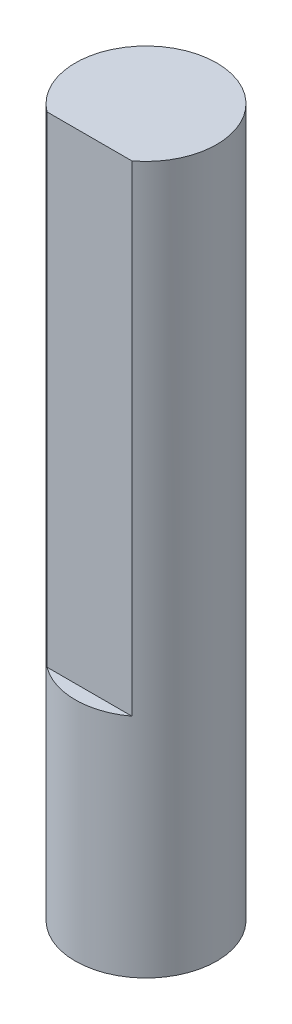
ISO-10303-21;
HEADER;
FILE_DESCRIPTION(('STEP AP214'),'2;1');
FILE_NAME('part.step','',(''),(''),'','','');
FILE_SCHEMA(('AUTOMOTIVE_DESIGN { 1 0 10303 214 1 1 1 1 }'));
ENDSEC;
DATA;
#1=APPLICATION_CONTEXT('core data for automotive mechanical design processes');
#2=APPLICATION_PROTOCOL_DEFINITION('international standard','automotive_design',2000,#1);
#3=PRODUCT_CONTEXT('',#1,'mechanical');
#4=PRODUCT('Part','Part','',(#3));
#5=PRODUCT_RELATED_PRODUCT_CATEGORY('part','',(#4));
#6=PRODUCT_DEFINITION_FORMATION('','',#4);
#7=PRODUCT_DEFINITION_CONTEXT('part definition',#1,'design');
#8=PRODUCT_DEFINITION('design','',#6,#7);
#9=PRODUCT_DEFINITION_SHAPE('','',#8);
#10=(LENGTH_UNIT() NAMED_UNIT(*) SI_UNIT(.MILLI.,.METRE.));
#11=(NAMED_UNIT(*) PLANE_ANGLE_UNIT() SI_UNIT($,.RADIAN.));
#12=(NAMED_UNIT(*) SI_UNIT($,.STERADIAN.) SOLID_ANGLE_UNIT());
#13=UNCERTAINTY_MEASURE_WITH_UNIT(LENGTH_MEASURE(1.E-05),#10,'distance_accuracy_value','');
#14=(GEOMETRIC_REPRESENTATION_CONTEXT(3) GLOBAL_UNCERTAINTY_ASSIGNED_CONTEXT((#13)) GLOBAL_UNIT_ASSIGNED_CONTEXT((#10,
#11,#12)) REPRESENTATION_CONTEXT('',''));
#15=CARTESIAN_POINT('',(0.,0.,0.));
#16=DIRECTION('',(0.,0.,1.));
#17=DIRECTION('',(1.,0.,0.));
#18=AXIS2_PLACEMENT_3D('',#15,#16,#17);
#19=CARTESIAN_POINT('',(0.,25.,0.));
#20=DIRECTION('',(0.,-1.,0.));
#21=DIRECTION('',(0.,0.,-1.));
#22=AXIS2_PLACEMENT_3D('',#19,#20,#21);
#23=CYLINDRICAL_SURFACE('',#22,2.5);
#24=CARTESIAN_POINT('',(0.,0.,0.));
#25=DIRECTION('',(0.,1.,0.));
#26=DIRECTION('',(0.,0.,1.));
#27=AXIS2_PLACEMENT_3D('',#24,#25,#26);
#28=CIRCLE('',#27,2.5);
#29=CARTESIAN_POINT('',(0.,0.,2.5));
#30=VERTEX_POINT('',#29);
#31=EDGE_CURVE('E38',#30,#30,#28,.T.);
#32=ORIENTED_EDGE('',*,*,#31,.T.);
#33=EDGE_LOOP('',(#32));
#34=FACE_BOUND('',#33,.T.);
#35=DIRECTION('',(0.,1.,0.));
#36=VECTOR('',#35,1.);
#37=CARTESIAN_POINT('',(-1.5,8.,2.));
#38=LINE('',#37,#36);
#39=CARTESIAN_POINT('',(-1.5,8.,2.));
#40=VERTEX_POINT('',#39);
#41=CARTESIAN_POINT('',(-1.5,25.,2.));
#42=VERTEX_POINT('',#41);
#43=EDGE_CURVE('E62',#40,#42,#38,.T.);
#44=ORIENTED_EDGE('',*,*,#43,.T.);
#45=CARTESIAN_POINT('',(0.,25.,0.));
#46=DIRECTION('',(0.,1.,0.));
#47=DIRECTION('',(0.,0.,1.));
#48=AXIS2_PLACEMENT_3D('',#45,#46,#47);
#49=CIRCLE('',#48,2.5);
#50=CARTESIAN_POINT('',(1.5,25.,2.));
#51=VERTEX_POINT('',#50);
#52=EDGE_CURVE('E11',#51,#42,#49,.T.);
#53=ORIENTED_EDGE('',*,*,#52,.F.);
#54=DIRECTION('',(0.,1.,0.));
#55=VECTOR('',#54,1.);
#56=CARTESIAN_POINT('',(1.5,8.,2.));
#57=LINE('',#56,#55);
#58=CARTESIAN_POINT('',(1.5,8.,2.));
#59=VERTEX_POINT('',#58);
#60=EDGE_CURVE('E49',#59,#51,#57,.T.);
#61=ORIENTED_EDGE('',*,*,#60,.F.);
#62=CARTESIAN_POINT('',(0.,8.,0.));
#63=DIRECTION('',(0.,1.,0.));
#64=DIRECTION('',(0.,0.,1.));
#65=AXIS2_PLACEMENT_3D('',#62,#63,#64);
#66=CIRCLE('',#65,2.5);
#67=EDGE_CURVE('E68',#40,#59,#66,.T.);
#68=ORIENTED_EDGE('',*,*,#67,.F.);
#69=EDGE_LOOP('',(#44,#53,#61,#68));
#70=FACE_BOUND('',#69,.T.);
#71=ADVANCED_FACE('F35',(#34,#70),#23,.T.);
#72=CARTESIAN_POINT('',(0.,25.,0.));
#73=DIRECTION('',(0.,1.,0.));
#74=DIRECTION('',(0.,0.,1.));
#75=AXIS2_PLACEMENT_3D('',#72,#73,#74);
#76=PLANE('',#75);
#77=ORIENTED_EDGE('',*,*,#52,.T.);
#78=DIRECTION('',(1.,0.,0.));
#79=VECTOR('',#78,1.);
#80=CARTESIAN_POINT('',(0.,25.,2.));
#81=LINE('',#80,#79);
#82=EDGE_CURVE('E59',#42,#51,#81,.T.);
#83=ORIENTED_EDGE('',*,*,#82,.T.);
#84=EDGE_LOOP('',(#77,#83));
#85=FACE_BOUND('',#84,.T.);
#86=ADVANCED_FACE('F70',(#85),#76,.T.);
#87=CARTESIAN_POINT('',(0.,0.,0.));
#88=DIRECTION('',(0.,1.,0.));
#89=DIRECTION('',(0.,0.,1.));
#90=AXIS2_PLACEMENT_3D('',#87,#88,#89);
#91=PLANE('',#90);
#92=ORIENTED_EDGE('',*,*,#31,.F.);
#93=EDGE_LOOP('',(#92));
#94=FACE_BOUND('',#93,.T.);
#95=ADVANCED_FACE('F72',(#94),#91,.F.);
#96=CARTESIAN_POINT('',(0.,8.,2.));
#97=DIRECTION('',(0.,0.,1.));
#98=DIRECTION('',(1.,0.,0.));
#99=AXIS2_PLACEMENT_3D('',#96,#97,#98);
#100=PLANE('',#99);
#101=ORIENTED_EDGE('',*,*,#82,.F.);
#102=ORIENTED_EDGE('',*,*,#43,.F.);
#103=DIRECTION('',(1.,0.,0.));
#104=VECTOR('',#103,1.);
#105=CARTESIAN_POINT('',(0.,8.,2.));
#106=LINE('',#105,#104);
#107=EDGE_CURVE('E55',#40,#59,#106,.T.);
#108=ORIENTED_EDGE('',*,*,#107,.T.);
#109=ORIENTED_EDGE('',*,*,#60,.T.);
#110=EDGE_LOOP('',(#101,#102,#108,#109));
#111=FACE_BOUND('',#110,.T.);
#112=ADVANCED_FACE('F61',(#111),#100,.T.);
#113=CARTESIAN_POINT('',(0.,8.,0.));
#114=DIRECTION('',(0.,1.,0.));
#115=DIRECTION('',(0.,0.,1.));
#116=AXIS2_PLACEMENT_3D('',#113,#114,#115);
#117=PLANE('',#116);
#118=ORIENTED_EDGE('',*,*,#107,.F.);
#119=ORIENTED_EDGE('',*,*,#67,.T.);
#120=EDGE_LOOP('',(#118,#119));
#121=FACE_BOUND('',#120,.T.);
#122=ADVANCED_FACE('F83',(#121),#117,.T.);
#123=CLOSED_SHELL('',(#71,#86,#95,#112,#122));
#124=MANIFOLD_SOLID_BREP('B2',#123);
#125=ADVANCED_BREP_SHAPE_REPRESENTATION('',(#18,#124),#14);
#126=SHAPE_DEFINITION_REPRESENTATION(#9,#125);
ENDSEC;
END-ISO-10303-21;
